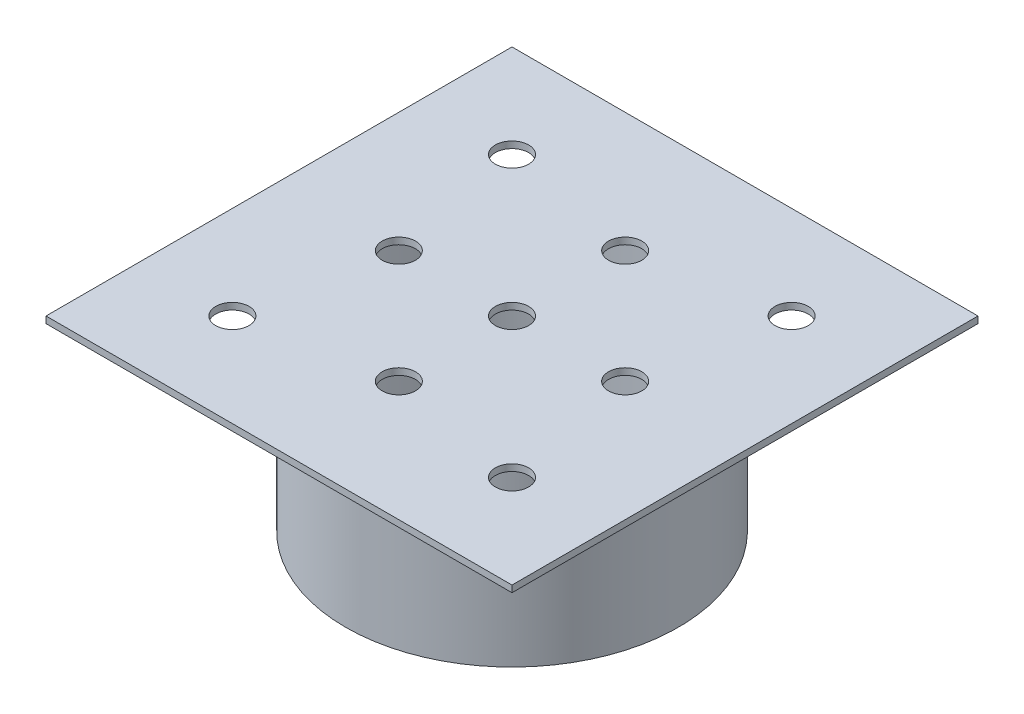
ISO-10303-21;
HEADER;
FILE_DESCRIPTION(('STEP AP214'),'2;1');
FILE_NAME('part.step','',(''),(''),'','','');
FILE_SCHEMA(('AUTOMOTIVE_DESIGN { 1 0 10303 214 1 1 1 1 }'));
ENDSEC;
DATA;
#1=APPLICATION_CONTEXT('core data for automotive mechanical design processes');
#2=APPLICATION_PROTOCOL_DEFINITION('international standard','automotive_design',2000,#1);
#3=PRODUCT_CONTEXT('',#1,'mechanical');
#4=PRODUCT('Part','Part','',(#3));
#5=PRODUCT_RELATED_PRODUCT_CATEGORY('part','',(#4));
#6=PRODUCT_DEFINITION_FORMATION('','',#4);
#7=PRODUCT_DEFINITION_CONTEXT('part definition',#1,'design');
#8=PRODUCT_DEFINITION('design','',#6,#7);
#9=PRODUCT_DEFINITION_SHAPE('','',#8);
#10=(LENGTH_UNIT() NAMED_UNIT(*) SI_UNIT(.MILLI.,.METRE.));
#11=(NAMED_UNIT(*) PLANE_ANGLE_UNIT() SI_UNIT($,.RADIAN.));
#12=(NAMED_UNIT(*) SI_UNIT($,.STERADIAN.) SOLID_ANGLE_UNIT());
#13=UNCERTAINTY_MEASURE_WITH_UNIT(LENGTH_MEASURE(1.E-05),#10,'distance_accuracy_value','');
#14=(GEOMETRIC_REPRESENTATION_CONTEXT(3) GLOBAL_UNCERTAINTY_ASSIGNED_CONTEXT((#13)) GLOBAL_UNIT_ASSIGNED_CONTEXT((#10,
#11,#12)) REPRESENTATION_CONTEXT('',''));
#15=CARTESIAN_POINT('',(0.,0.,0.));
#16=DIRECTION('',(0.,0.,1.));
#17=DIRECTION('',(1.,0.,0.));
#18=AXIS2_PLACEMENT_3D('',#15,#16,#17);
#19=CARTESIAN_POINT('',(35.,1.,-35.));
#20=DIRECTION('',(-1.,0.,0.));
#21=DIRECTION('',(0.,0.,1.));
#22=AXIS2_PLACEMENT_3D('',#19,#20,#21);
#23=PLANE('',#22);
#24=DIRECTION('',(0.,0.,-1.));
#25=VECTOR('',#24,1.);
#26=CARTESIAN_POINT('',(35.,0.,-35.));
#27=LINE('',#26,#25);
#28=CARTESIAN_POINT('',(35.,0.,35.));
#29=VERTEX_POINT('',#28);
#30=CARTESIAN_POINT('',(35.,0.,-35.));
#31=VERTEX_POINT('',#30);
#32=EDGE_CURVE('E113',#29,#31,#27,.T.);
#33=ORIENTED_EDGE('',*,*,#32,.T.);
#34=DIRECTION('',(0.,-1.,0.));
#35=VECTOR('',#34,1.);
#36=CARTESIAN_POINT('',(35.,1.,-35.));
#37=LINE('',#36,#35);
#38=CARTESIAN_POINT('',(35.,1.,-35.));
#39=VERTEX_POINT('',#38);
#40=EDGE_CURVE('E55',#39,#31,#37,.T.);
#41=ORIENTED_EDGE('',*,*,#40,.F.);
#42=DIRECTION('',(0.,0.,-1.));
#43=VECTOR('',#42,1.);
#44=CARTESIAN_POINT('',(35.,1.,-35.));
#45=LINE('',#44,#43);
#46=CARTESIAN_POINT('',(35.,1.,35.));
#47=VERTEX_POINT('',#46);
#48=EDGE_CURVE('E99',#47,#39,#45,.T.);
#49=ORIENTED_EDGE('',*,*,#48,.F.);
#50=DIRECTION('',(0.,-1.,0.));
#51=VECTOR('',#50,1.);
#52=CARTESIAN_POINT('',(35.,1.,35.));
#53=LINE('',#52,#51);
#54=EDGE_CURVE('E109',#47,#29,#53,.T.);
#55=ORIENTED_EDGE('',*,*,#54,.T.);
#56=EDGE_LOOP('',(#33,#41,#49,#55));
#57=FACE_BOUND('',#56,.T.);
#58=ADVANCED_FACE('F47',(#57),#23,.F.);
#59=CARTESIAN_POINT('',(-35.,1.,-35.));
#60=DIRECTION('',(0.,0.,1.));
#61=DIRECTION('',(1.,0.,0.));
#62=AXIS2_PLACEMENT_3D('',#59,#60,#61);
#63=PLANE('',#62);
#64=DIRECTION('',(-1.,0.,0.));
#65=VECTOR('',#64,1.);
#66=CARTESIAN_POINT('',(-35.,0.,-35.));
#67=LINE('',#66,#65);
#68=CARTESIAN_POINT('',(-35.,0.,-35.));
#69=VERTEX_POINT('',#68);
#70=EDGE_CURVE('E104',#31,#69,#67,.T.);
#71=ORIENTED_EDGE('',*,*,#70,.T.);
#72=DIRECTION('',(0.,-1.,0.));
#73=VECTOR('',#72,1.);
#74=CARTESIAN_POINT('',(-35.,1.,-35.));
#75=LINE('',#74,#73);
#76=CARTESIAN_POINT('',(-35.,1.,-35.));
#77=VERTEX_POINT('',#76);
#78=EDGE_CURVE('E102',#77,#69,#75,.T.);
#79=ORIENTED_EDGE('',*,*,#78,.F.);
#80=DIRECTION('',(-1.,0.,0.));
#81=VECTOR('',#80,1.);
#82=CARTESIAN_POINT('',(-35.,1.,-35.));
#83=LINE('',#82,#81);
#84=EDGE_CURVE('E94',#39,#77,#83,.T.);
#85=ORIENTED_EDGE('',*,*,#84,.F.);
#86=ORIENTED_EDGE('',*,*,#40,.T.);
#87=EDGE_LOOP('',(#71,#79,#85,#86));
#88=FACE_BOUND('',#87,.T.);
#89=ADVANCED_FACE('F103',(#88),#63,.F.);
#90=CARTESIAN_POINT('',(-35.,1.,-35.));
#91=DIRECTION('',(1.,0.,0.));
#92=DIRECTION('',(0.,0.,-1.));
#93=AXIS2_PLACEMENT_3D('',#90,#91,#92);
#94=PLANE('',#93);
#95=DIRECTION('',(0.,0.,1.));
#96=VECTOR('',#95,1.);
#97=CARTESIAN_POINT('',(-35.,0.,-35.));
#98=LINE('',#97,#96);
#99=CARTESIAN_POINT('',(-35.,0.,35.));
#100=VERTEX_POINT('',#99);
#101=EDGE_CURVE('E80',#69,#100,#98,.T.);
#102=ORIENTED_EDGE('',*,*,#101,.T.);
#103=DIRECTION('',(0.,-1.,0.));
#104=VECTOR('',#103,1.);
#105=CARTESIAN_POINT('',(-35.,1.,35.));
#106=LINE('',#105,#104);
#107=CARTESIAN_POINT('',(-35.,1.,35.));
#108=VERTEX_POINT('',#107);
#109=EDGE_CURVE('E105',#108,#100,#106,.T.);
#110=ORIENTED_EDGE('',*,*,#109,.F.);
#111=DIRECTION('',(0.,0.,1.));
#112=VECTOR('',#111,1.);
#113=CARTESIAN_POINT('',(-35.,1.,-35.));
#114=LINE('',#113,#112);
#115=EDGE_CURVE('E97',#77,#108,#114,.T.);
#116=ORIENTED_EDGE('',*,*,#115,.F.);
#117=ORIENTED_EDGE('',*,*,#78,.T.);
#118=EDGE_LOOP('',(#102,#110,#116,#117));
#119=FACE_BOUND('',#118,.T.);
#120=ADVANCED_FACE('F107',(#119),#94,.F.);
#121=CARTESIAN_POINT('',(-35.,1.,35.));
#122=DIRECTION('',(0.,0.,-1.));
#123=DIRECTION('',(-1.,0.,0.));
#124=AXIS2_PLACEMENT_3D('',#121,#122,#123);
#125=PLANE('',#124);
#126=DIRECTION('',(1.,0.,0.));
#127=VECTOR('',#126,1.);
#128=CARTESIAN_POINT('',(-35.,0.,35.));
#129=LINE('',#128,#127);
#130=EDGE_CURVE('E86',#100,#29,#129,.T.);
#131=ORIENTED_EDGE('',*,*,#130,.T.);
#132=ORIENTED_EDGE('',*,*,#54,.F.);
#133=DIRECTION('',(1.,0.,0.));
#134=VECTOR('',#133,1.);
#135=CARTESIAN_POINT('',(-35.,1.,35.));
#136=LINE('',#135,#134);
#137=EDGE_CURVE('E63',#108,#47,#136,.T.);
#138=ORIENTED_EDGE('',*,*,#137,.F.);
#139=ORIENTED_EDGE('',*,*,#109,.T.);
#140=EDGE_LOOP('',(#131,#132,#138,#139));
#141=FACE_BOUND('',#140,.T.);
#142=ADVANCED_FACE('F137',(#141),#125,.F.);
#143=CARTESIAN_POINT('',(0.,1.,0.));
#144=DIRECTION('',(0.,1.,0.));
#145=DIRECTION('',(0.,0.,1.));
#146=AXIS2_PLACEMENT_3D('',#143,#144,#145);
#147=PLANE('',#146);
#148=CARTESIAN_POINT('',(-21.,1.,-21.));
#149=DIRECTION('',(0.,1.,0.));
#150=DIRECTION('',(0.,0.,1.));
#151=AXIS2_PLACEMENT_3D('',#148,#149,#150);
#152=CIRCLE('',#151,2.50000000000181);
#153=CARTESIAN_POINT('',(-21.,1.,-18.4999999999982));
#154=VERTEX_POINT('',#153);
#155=EDGE_CURVE('E297',#154,#154,#152,.T.);
#156=ORIENTED_EDGE('',*,*,#155,.F.);
#157=EDGE_LOOP('',(#156));
#158=FACE_BOUND('',#157,.T.);
#159=CARTESIAN_POINT('',(-20.9999999999988,1.,21.));
#160=DIRECTION('',(0.,1.,0.));
#161=DIRECTION('',(0.,0.,1.));
#162=AXIS2_PLACEMENT_3D('',#159,#160,#161);
#163=CIRCLE('',#162,2.50000000000242);
#164=CARTESIAN_POINT('',(-20.9999999999988,1.,23.5000000000024));
#165=VERTEX_POINT('',#164);
#166=EDGE_CURVE('E302',#165,#165,#163,.T.);
#167=ORIENTED_EDGE('',*,*,#166,.F.);
#168=EDGE_LOOP('',(#167));
#169=FACE_BOUND('',#168,.T.);
#170=CARTESIAN_POINT('',(21.0000000000012,1.,20.9999999999988));
#171=DIRECTION('',(0.,1.,0.));
#172=DIRECTION('',(0.,0.,1.));
#173=AXIS2_PLACEMENT_3D('',#170,#171,#172);
#174=CIRCLE('',#173,2.50000000000346);
#175=CARTESIAN_POINT('',(21.0000000000012,1.,23.5000000000023));
#176=VERTEX_POINT('',#175);
#177=EDGE_CURVE('E308',#176,#176,#174,.T.);
#178=ORIENTED_EDGE('',*,*,#177,.F.);
#179=EDGE_LOOP('',(#178));
#180=FACE_BOUND('',#179,.T.);
#181=CARTESIAN_POINT('',(21.,1.,-21.0000000000012));
#182=DIRECTION('',(0.,1.,0.));
#183=DIRECTION('',(0.,0.,1.));
#184=AXIS2_PLACEMENT_3D('',#181,#182,#183);
#185=CIRCLE('',#184,2.50000000000302);
#186=CARTESIAN_POINT('',(21.,1.,-18.4999999999982));
#187=VERTEX_POINT('',#186);
#188=EDGE_CURVE('E291',#187,#187,#185,.T.);
#189=ORIENTED_EDGE('',*,*,#188,.F.);
#190=EDGE_LOOP('',(#189));
#191=FACE_BOUND('',#190,.T.);
#192=CARTESIAN_POINT('',(0.,1.,-17.));
#193=DIRECTION('',(0.,1.,0.));
#194=DIRECTION('',(0.,0.,1.));
#195=AXIS2_PLACEMENT_3D('',#192,#193,#194);
#196=CIRCLE('',#195,2.5);
#197=CARTESIAN_POINT('',(0.,1.,-14.5));
#198=VERTEX_POINT('',#197);
#199=EDGE_CURVE('E274',#198,#198,#196,.T.);
#200=ORIENTED_EDGE('',*,*,#199,.F.);
#201=EDGE_LOOP('',(#200));
#202=FACE_BOUND('',#201,.T.);
#203=CARTESIAN_POINT('',(17.0000000000005,1.,-4.80046210979042E-13));
#204=DIRECTION('',(0.,1.,0.));
#205=DIRECTION('',(0.,0.,1.));
#206=AXIS2_PLACEMENT_3D('',#203,#204,#205);
#207=CIRCLE('',#206,2.50000000000038);
#208=CARTESIAN_POINT('',(17.0000000000005,1.,2.4999999999999));
#209=VERTEX_POINT('',#208);
#210=EDGE_CURVE('E267',#209,#209,#207,.T.);
#211=ORIENTED_EDGE('',*,*,#210,.F.);
#212=EDGE_LOOP('',(#211));
#213=FACE_BOUND('',#212,.T.);
#214=CARTESIAN_POINT('',(9.60092421958085E-13,1.,17.));
#215=DIRECTION('',(0.,1.,0.));
#216=DIRECTION('',(0.,0.,1.));
#217=AXIS2_PLACEMENT_3D('',#214,#215,#216);
#218=CIRCLE('',#217,2.50000000000103);
#219=CARTESIAN_POINT('',(9.60092421958085E-13,1.,19.500000000001));
#220=VERTEX_POINT('',#219);
#221=EDGE_CURVE('E286',#220,#220,#218,.T.);
#222=ORIENTED_EDGE('',*,*,#221,.F.);
#223=EDGE_LOOP('',(#222));
#224=FACE_BOUND('',#223,.T.);
#225=CARTESIAN_POINT('',(-16.9999999999995,1.,4.82128110537593E-13));
#226=DIRECTION('',(0.,1.,0.));
#227=DIRECTION('',(0.,0.,1.));
#228=AXIS2_PLACEMENT_3D('',#225,#226,#227);
#229=CIRCLE('',#228,2.50000000000077);
#230=CARTESIAN_POINT('',(-16.9999999999995,1.,2.50000000000125));
#231=VERTEX_POINT('',#230);
#232=EDGE_CURVE('E279',#231,#231,#229,.T.);
#233=ORIENTED_EDGE('',*,*,#232,.F.);
#234=EDGE_LOOP('',(#233));
#235=FACE_BOUND('',#234,.T.);
#236=CARTESIAN_POINT('',(0.,1.,0.));
#237=DIRECTION('',(0.,1.,0.));
#238=DIRECTION('',(0.,0.,1.));
#239=AXIS2_PLACEMENT_3D('',#236,#237,#238);
#240=CIRCLE('',#239,2.5);
#241=CARTESIAN_POINT('',(0.,1.,2.5));
#242=VERTEX_POINT('',#241);
#243=EDGE_CURVE('E261',#242,#242,#240,.T.);
#244=ORIENTED_EDGE('',*,*,#243,.F.);
#245=EDGE_LOOP('',(#244));
#246=FACE_BOUND('',#245,.T.);
#247=ORIENTED_EDGE('',*,*,#48,.T.);
#248=ORIENTED_EDGE('',*,*,#84,.T.);
#249=ORIENTED_EDGE('',*,*,#115,.T.);
#250=ORIENTED_EDGE('',*,*,#137,.T.);
#251=EDGE_LOOP('',(#247,#248,#249,#250));
#252=FACE_BOUND('',#251,.T.);
#253=ADVANCED_FACE('F95',(#158,#169,#180,#191,#202,#213,#224,#235,#246,#252),#147,.T.);
#254=CARTESIAN_POINT('',(0.,0.,0.));
#255=DIRECTION('',(0.,1.,0.));
#256=DIRECTION('',(0.,0.,1.));
#257=AXIS2_PLACEMENT_3D('',#254,#255,#256);
#258=PLANE('',#257);
#259=CARTESIAN_POINT('',(-21.,0.,-21.));
#260=DIRECTION('',(0.,1.,0.));
#261=DIRECTION('',(0.,0.,1.));
#262=AXIS2_PLACEMENT_3D('',#259,#260,#261);
#263=CIRCLE('',#262,2.50000000000181);
#264=CARTESIAN_POINT('',(-21.,0.,-18.4999999999982));
#265=VERTEX_POINT('',#264);
#266=EDGE_CURVE('E300',#265,#265,#263,.T.);
#267=ORIENTED_EDGE('',*,*,#266,.T.);
#268=EDGE_LOOP('',(#267));
#269=FACE_BOUND('',#268,.T.);
#270=CARTESIAN_POINT('',(-20.9999999999988,0.,21.));
#271=DIRECTION('',(0.,1.,0.));
#272=DIRECTION('',(0.,0.,1.));
#273=AXIS2_PLACEMENT_3D('',#270,#271,#272);
#274=CIRCLE('',#273,2.50000000000242);
#275=CARTESIAN_POINT('',(-20.9999999999988,0.,23.5000000000024));
#276=VERTEX_POINT('',#275);
#277=EDGE_CURVE('E305',#276,#276,#274,.T.);
#278=ORIENTED_EDGE('',*,*,#277,.T.);
#279=EDGE_LOOP('',(#278));
#280=FACE_BOUND('',#279,.T.);
#281=CARTESIAN_POINT('',(21.0000000000012,0.,20.9999999999988));
#282=DIRECTION('',(0.,1.,0.));
#283=DIRECTION('',(0.,0.,1.));
#284=AXIS2_PLACEMENT_3D('',#281,#282,#283);
#285=CIRCLE('',#284,2.50000000000346);
#286=CARTESIAN_POINT('',(21.0000000000012,0.,23.5000000000023));
#287=VERTEX_POINT('',#286);
#288=EDGE_CURVE('E294',#287,#287,#285,.T.);
#289=ORIENTED_EDGE('',*,*,#288,.T.);
#290=EDGE_LOOP('',(#289));
#291=FACE_BOUND('',#290,.T.);
#292=CARTESIAN_POINT('',(21.,0.,-21.0000000000012));
#293=DIRECTION('',(0.,1.,0.));
#294=DIRECTION('',(0.,0.,1.));
#295=AXIS2_PLACEMENT_3D('',#292,#293,#294);
#296=CIRCLE('',#295,2.50000000000302);
#297=CARTESIAN_POINT('',(21.,0.,-18.4999999999982));
#298=VERTEX_POINT('',#297);
#299=EDGE_CURVE('E283',#298,#298,#296,.T.);
#300=ORIENTED_EDGE('',*,*,#299,.T.);
#301=EDGE_LOOP('',(#300));
#302=FACE_BOUND('',#301,.T.);
#303=CARTESIAN_POINT('',(0.,0.,0.));
#304=DIRECTION('',(0.,1.,0.));
#305=DIRECTION('',(0.,0.,1.));
#306=AXIS2_PLACEMENT_3D('',#303,#304,#305);
#307=CIRCLE('',#306,25.);
#308=CARTESIAN_POINT('',(0.,0.,25.));
#309=VERTEX_POINT('',#308);
#310=EDGE_CURVE('E13',#309,#309,#307,.F.);
#311=ORIENTED_EDGE('',*,*,#310,.F.);
#312=EDGE_LOOP('',(#311));
#313=FACE_BOUND('',#312,.T.);
#314=ORIENTED_EDGE('',*,*,#32,.F.);
#315=ORIENTED_EDGE('',*,*,#130,.F.);
#316=ORIENTED_EDGE('',*,*,#101,.F.);
#317=ORIENTED_EDGE('',*,*,#70,.F.);
#318=EDGE_LOOP('',(#314,#315,#316,#317));
#319=FACE_BOUND('',#318,.T.);
#320=ADVANCED_FACE('F124',(#269,#280,#291,#302,#313,#319),#258,.F.);
#321=CARTESIAN_POINT('',(0.,-27.,0.));
#322=DIRECTION('',(0.,-1.,0.));
#323=DIRECTION('',(0.,0.,-1.));
#324=AXIS2_PLACEMENT_3D('',#321,#322,#323);
#325=PLANE('',#324);
#326=CARTESIAN_POINT('',(0.,-27.,0.));
#327=DIRECTION('',(0.,-1.,0.));
#328=DIRECTION('',(0.,0.,-1.));
#329=AXIS2_PLACEMENT_3D('',#326,#327,#328);
#330=CIRCLE('',#329,25.);
#331=CARTESIAN_POINT('',(0.,-27.,-25.));
#332=VERTEX_POINT('',#331);
#333=EDGE_CURVE('E116',#332,#332,#330,.T.);
#334=ORIENTED_EDGE('',*,*,#333,.T.);
#335=EDGE_LOOP('',(#334));
#336=FACE_BOUND('',#335,.T.);
#337=CARTESIAN_POINT('',(0.,-27.,0.));
#338=DIRECTION('',(0.,-1.,0.));
#339=DIRECTION('',(0.,0.,-1.));
#340=AXIS2_PLACEMENT_3D('',#337,#338,#339);
#341=CIRCLE('',#340,23.);
#342=CARTESIAN_POINT('',(0.,-27.,-23.));
#343=VERTEX_POINT('',#342);
#344=EDGE_CURVE('E252',#343,#343,#341,.T.);
#345=ORIENTED_EDGE('',*,*,#344,.F.);
#346=EDGE_LOOP('',(#345));
#347=FACE_BOUND('',#346,.T.);
#348=ADVANCED_FACE('F126',(#336,#347),#325,.T.);
#349=CARTESIAN_POINT('',(0.,-27.,0.));
#350=DIRECTION('',(0.,1.,0.));
#351=DIRECTION('',(0.,0.,1.));
#352=AXIS2_PLACEMENT_3D('',#349,#350,#351);
#353=CYLINDRICAL_SURFACE('',#352,25.);
#354=ORIENTED_EDGE('',*,*,#333,.F.);
#355=EDGE_LOOP('',(#354));
#356=FACE_BOUND('',#355,.T.);
#357=ORIENTED_EDGE('',*,*,#310,.T.);
#358=EDGE_LOOP('',(#357));
#359=FACE_BOUND('',#358,.T.);
#360=ADVANCED_FACE('F134',(#356,#359),#353,.T.);
#361=CARTESIAN_POINT('',(0.,-27.,0.));
#362=DIRECTION('',(0.,1.,0.));
#363=DIRECTION('',(0.,0.,1.));
#364=AXIS2_PLACEMENT_3D('',#361,#362,#363);
#365=CYLINDRICAL_SURFACE('',#364,23.);
#366=ORIENTED_EDGE('',*,*,#344,.T.);
#367=EDGE_LOOP('',(#366));
#368=FACE_BOUND('',#367,.T.);
#369=CARTESIAN_POINT('',(0.,0.,0.));
#370=DIRECTION('',(0.,-1.,0.));
#371=DIRECTION('',(0.,0.,-1.));
#372=AXIS2_PLACEMENT_3D('',#369,#370,#371);
#373=CIRCLE('',#372,23.);
#374=CARTESIAN_POINT('',(0.,0.,-23.));
#375=VERTEX_POINT('',#374);
#376=EDGE_CURVE('E255',#375,#375,#373,.T.);
#377=ORIENTED_EDGE('',*,*,#376,.F.);
#378=EDGE_LOOP('',(#377));
#379=FACE_BOUND('',#378,.T.);
#380=ADVANCED_FACE('F145',(#368,#379),#365,.F.);
#381=CARTESIAN_POINT('',(0.,0.,-17.));
#382=DIRECTION('',(0.,1.,0.));
#383=DIRECTION('',(0.,0.,1.));
#384=AXIS2_PLACEMENT_3D('',#381,#382,#383);
#385=CIRCLE('',#384,2.5);
#386=CARTESIAN_POINT('',(0.,0.,-14.5));
#387=VERTEX_POINT('',#386);
#388=EDGE_CURVE('E264',#387,#387,#385,.T.);
#389=ORIENTED_EDGE('',*,*,#388,.T.);
#390=EDGE_LOOP('',(#389));
#391=FACE_BOUND('',#390,.T.);
#392=CARTESIAN_POINT('',(17.0000000000005,0.,-4.80046210979042E-13));
#393=DIRECTION('',(0.,1.,0.));
#394=DIRECTION('',(0.,0.,1.));
#395=AXIS2_PLACEMENT_3D('',#392,#393,#394);
#396=CIRCLE('',#395,2.50000000000038);
#397=CARTESIAN_POINT('',(17.0000000000005,0.,2.4999999999999));
#398=VERTEX_POINT('',#397);
#399=EDGE_CURVE('E270',#398,#398,#396,.T.);
#400=ORIENTED_EDGE('',*,*,#399,.T.);
#401=EDGE_LOOP('',(#400));
#402=FACE_BOUND('',#401,.T.);
#403=CARTESIAN_POINT('',(9.60092421958085E-13,0.,17.));
#404=DIRECTION('',(0.,1.,0.));
#405=DIRECTION('',(0.,0.,1.));
#406=AXIS2_PLACEMENT_3D('',#403,#404,#405);
#407=CIRCLE('',#406,2.50000000000103);
#408=CARTESIAN_POINT('',(9.60092421958085E-13,0.,19.500000000001));
#409=VERTEX_POINT('',#408);
#410=EDGE_CURVE('E271',#409,#409,#407,.T.);
#411=ORIENTED_EDGE('',*,*,#410,.T.);
#412=EDGE_LOOP('',(#411));
#413=FACE_BOUND('',#412,.T.);
#414=CARTESIAN_POINT('',(-16.9999999999995,0.,4.82128110537593E-13));
#415=DIRECTION('',(0.,1.,0.));
#416=DIRECTION('',(0.,0.,1.));
#417=AXIS2_PLACEMENT_3D('',#414,#415,#416);
#418=CIRCLE('',#417,2.50000000000077);
#419=CARTESIAN_POINT('',(-16.9999999999995,0.,2.50000000000125));
#420=VERTEX_POINT('',#419);
#421=EDGE_CURVE('E282',#420,#420,#418,.T.);
#422=ORIENTED_EDGE('',*,*,#421,.T.);
#423=EDGE_LOOP('',(#422));
#424=FACE_BOUND('',#423,.T.);
#425=CARTESIAN_POINT('',(0.,0.,0.));
#426=DIRECTION('',(0.,1.,0.));
#427=DIRECTION('',(0.,0.,1.));
#428=AXIS2_PLACEMENT_3D('',#425,#426,#427);
#429=CIRCLE('',#428,2.5);
#430=CARTESIAN_POINT('',(0.,0.,2.5));
#431=VERTEX_POINT('',#430);
#432=EDGE_CURVE('E259',#431,#431,#429,.T.);
#433=ORIENTED_EDGE('',*,*,#432,.T.);
#434=EDGE_LOOP('',(#433));
#435=FACE_BOUND('',#434,.T.);
#436=ORIENTED_EDGE('',*,*,#376,.T.);
#437=EDGE_LOOP('',(#436));
#438=FACE_BOUND('',#437,.T.);
#439=ADVANCED_FACE('F129',(#391,#402,#413,#424,#435,#438),#258,.F.);
#440=CARTESIAN_POINT('',(0.,0.,0.));
#441=DIRECTION('',(0.,1.,0.));
#442=DIRECTION('',(0.,0.,1.));
#443=AXIS2_PLACEMENT_3D('',#440,#441,#442);
#444=CYLINDRICAL_SURFACE('',#443,2.5);
#445=ORIENTED_EDGE('',*,*,#432,.F.);
#446=EDGE_LOOP('',(#445));
#447=FACE_BOUND('',#446,.T.);
#448=ORIENTED_EDGE('',*,*,#243,.T.);
#449=EDGE_LOOP('',(#448));
#450=FACE_BOUND('',#449,.T.);
#451=ADVANCED_FACE('F144',(#447,#450),#444,.F.);
#452=CARTESIAN_POINT('',(-16.9999999999995,0.,4.82128110537593E-13));
#453=DIRECTION('',(0.,1.,0.));
#454=DIRECTION('',(0.,0.,1.));
#455=AXIS2_PLACEMENT_3D('',#452,#453,#454);
#456=CYLINDRICAL_SURFACE('',#455,2.50000000000077);
#457=ORIENTED_EDGE('',*,*,#421,.F.);
#458=EDGE_LOOP('',(#457));
#459=FACE_BOUND('',#458,.T.);
#460=ORIENTED_EDGE('',*,*,#232,.T.);
#461=EDGE_LOOP('',(#460));
#462=FACE_BOUND('',#461,.T.);
#463=ADVANCED_FACE('F227',(#459,#462),#456,.F.);
#464=CARTESIAN_POINT('',(9.60092421958085E-13,0.,17.));
#465=DIRECTION('',(0.,1.,0.));
#466=DIRECTION('',(0.,0.,1.));
#467=AXIS2_PLACEMENT_3D('',#464,#465,#466);
#468=CYLINDRICAL_SURFACE('',#467,2.50000000000103);
#469=ORIENTED_EDGE('',*,*,#410,.F.);
#470=EDGE_LOOP('',(#469));
#471=FACE_BOUND('',#470,.T.);
#472=ORIENTED_EDGE('',*,*,#221,.T.);
#473=EDGE_LOOP('',(#472));
#474=FACE_BOUND('',#473,.T.);
#475=ADVANCED_FACE('F223',(#471,#474),#468,.F.);
#476=CARTESIAN_POINT('',(17.0000000000005,0.,-4.80046210979042E-13));
#477=DIRECTION('',(0.,1.,0.));
#478=DIRECTION('',(0.,0.,1.));
#479=AXIS2_PLACEMENT_3D('',#476,#477,#478);
#480=CYLINDRICAL_SURFACE('',#479,2.50000000000038);
#481=ORIENTED_EDGE('',*,*,#399,.F.);
#482=EDGE_LOOP('',(#481));
#483=FACE_BOUND('',#482,.T.);
#484=ORIENTED_EDGE('',*,*,#210,.T.);
#485=EDGE_LOOP('',(#484));
#486=FACE_BOUND('',#485,.T.);
#487=ADVANCED_FACE('F226',(#483,#486),#480,.F.);
#488=CARTESIAN_POINT('',(0.,0.,-17.));
#489=DIRECTION('',(0.,1.,0.));
#490=DIRECTION('',(0.,0.,1.));
#491=AXIS2_PLACEMENT_3D('',#488,#489,#490);
#492=CYLINDRICAL_SURFACE('',#491,2.5);
#493=ORIENTED_EDGE('',*,*,#388,.F.);
#494=EDGE_LOOP('',(#493));
#495=FACE_BOUND('',#494,.T.);
#496=ORIENTED_EDGE('',*,*,#199,.T.);
#497=EDGE_LOOP('',(#496));
#498=FACE_BOUND('',#497,.T.);
#499=ADVANCED_FACE('F171',(#495,#498),#492,.F.);
#500=CARTESIAN_POINT('',(21.,0.,-21.0000000000012));
#501=DIRECTION('',(0.,1.,0.));
#502=DIRECTION('',(0.,0.,1.));
#503=AXIS2_PLACEMENT_3D('',#500,#501,#502);
#504=CYLINDRICAL_SURFACE('',#503,2.50000000000302);
#505=ORIENTED_EDGE('',*,*,#299,.F.);
#506=EDGE_LOOP('',(#505));
#507=FACE_BOUND('',#506,.T.);
#508=ORIENTED_EDGE('',*,*,#188,.T.);
#509=EDGE_LOOP('',(#508));
#510=FACE_BOUND('',#509,.T.);
#511=ADVANCED_FACE('F181',(#507,#510),#504,.F.);
#512=CARTESIAN_POINT('',(21.0000000000012,0.,20.9999999999988));
#513=DIRECTION('',(0.,1.,0.));
#514=DIRECTION('',(0.,0.,1.));
#515=AXIS2_PLACEMENT_3D('',#512,#513,#514);
#516=CYLINDRICAL_SURFACE('',#515,2.50000000000346);
#517=ORIENTED_EDGE('',*,*,#288,.F.);
#518=EDGE_LOOP('',(#517));
#519=FACE_BOUND('',#518,.T.);
#520=ORIENTED_EDGE('',*,*,#177,.T.);
#521=EDGE_LOOP('',(#520));
#522=FACE_BOUND('',#521,.T.);
#523=ADVANCED_FACE('F186',(#519,#522),#516,.F.);
#524=CARTESIAN_POINT('',(-20.9999999999988,0.,21.));
#525=DIRECTION('',(0.,1.,0.));
#526=DIRECTION('',(0.,0.,1.));
#527=AXIS2_PLACEMENT_3D('',#524,#525,#526);
#528=CYLINDRICAL_SURFACE('',#527,2.50000000000242);
#529=ORIENTED_EDGE('',*,*,#277,.F.);
#530=EDGE_LOOP('',(#529));
#531=FACE_BOUND('',#530,.T.);
#532=ORIENTED_EDGE('',*,*,#166,.T.);
#533=EDGE_LOOP('',(#532));
#534=FACE_BOUND('',#533,.T.);
#535=ADVANCED_FACE('F196',(#531,#534),#528,.F.);
#536=CARTESIAN_POINT('',(-21.,0.,-21.));
#537=DIRECTION('',(0.,1.,0.));
#538=DIRECTION('',(0.,0.,1.));
#539=AXIS2_PLACEMENT_3D('',#536,#537,#538);
#540=CYLINDRICAL_SURFACE('',#539,2.50000000000181);
#541=ORIENTED_EDGE('',*,*,#266,.F.);
#542=EDGE_LOOP('',(#541));
#543=FACE_BOUND('',#542,.T.);
#544=ORIENTED_EDGE('',*,*,#155,.T.);
#545=EDGE_LOOP('',(#544));
#546=FACE_BOUND('',#545,.T.);
#547=ADVANCED_FACE('F206',(#543,#546),#540,.F.);
#548=CLOSED_SHELL('',(#58,#89,#120,#142,#253,#320,#348,#360,#380,#439,#451,#463,#475,#487,#499,
#511,#523,#535,#547));
#549=MANIFOLD_SOLID_BREP('B2',#548);
#550=ADVANCED_BREP_SHAPE_REPRESENTATION('',(#18,#549),#14);
#551=SHAPE_DEFINITION_REPRESENTATION(#9,#550);
ENDSEC;
END-ISO-10303-21;
